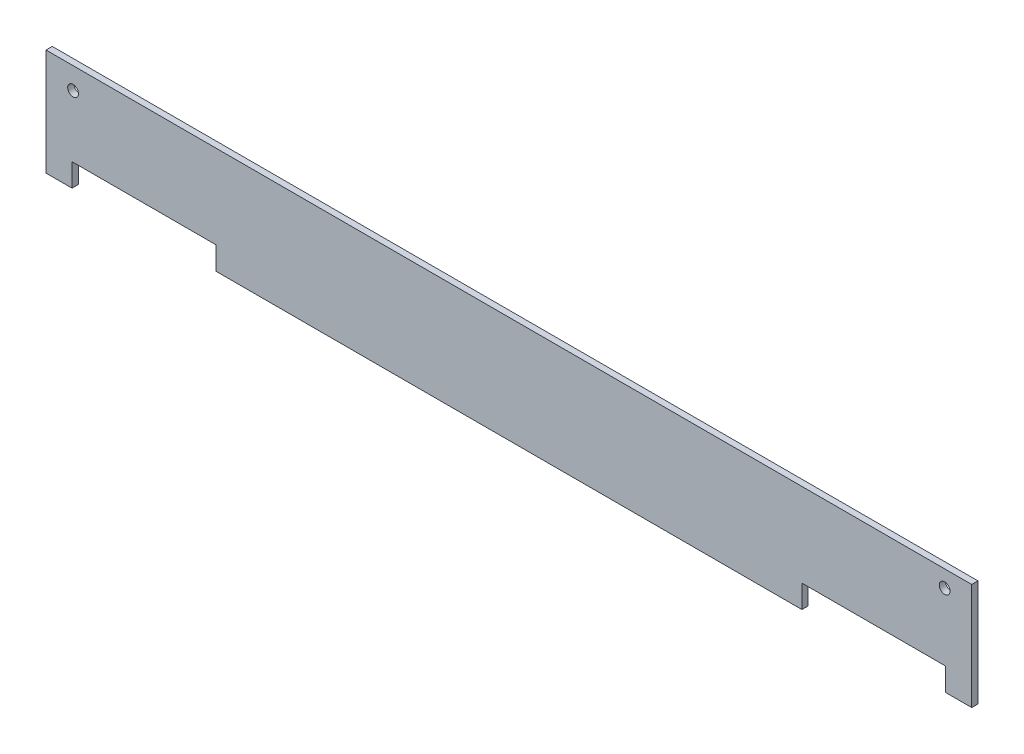
ISO-10303-21;
HEADER;
FILE_DESCRIPTION(('STEP AP214'),'2;1');
FILE_NAME('part.step','',(''),(''),'','','');
FILE_SCHEMA(('AUTOMOTIVE_DESIGN { 1 0 10303 214 1 1 1 1 }'));
ENDSEC;
DATA;
#1=APPLICATION_CONTEXT('core data for automotive mechanical design processes');
#2=APPLICATION_PROTOCOL_DEFINITION('international standard','automotive_design',2000,#1);
#3=PRODUCT_CONTEXT('',#1,'mechanical');
#4=PRODUCT('Part','Part','',(#3));
#5=PRODUCT_RELATED_PRODUCT_CATEGORY('part','',(#4));
#6=PRODUCT_DEFINITION_FORMATION('','',#4);
#7=PRODUCT_DEFINITION_CONTEXT('part definition',#1,'design');
#8=PRODUCT_DEFINITION('design','',#6,#7);
#9=PRODUCT_DEFINITION_SHAPE('','',#8);
#10=(LENGTH_UNIT() NAMED_UNIT(*) SI_UNIT(.MILLI.,.METRE.));
#11=(NAMED_UNIT(*) PLANE_ANGLE_UNIT() SI_UNIT($,.RADIAN.));
#12=(NAMED_UNIT(*) SI_UNIT($,.STERADIAN.) SOLID_ANGLE_UNIT());
#13=UNCERTAINTY_MEASURE_WITH_UNIT(LENGTH_MEASURE(1.E-05),#10,'distance_accuracy_value','');
#14=(GEOMETRIC_REPRESENTATION_CONTEXT(3) GLOBAL_UNCERTAINTY_ASSIGNED_CONTEXT((#13)) GLOBAL_UNIT_ASSIGNED_CONTEXT((#10,
#11,#12)) REPRESENTATION_CONTEXT('',''));
#15=CARTESIAN_POINT('',(0.,0.,0.));
#16=DIRECTION('',(0.,0.,1.));
#17=DIRECTION('',(1.,0.,0.));
#18=AXIS2_PLACEMENT_3D('',#15,#16,#17);
#19=CARTESIAN_POINT('',(0.,0.,3.));
#20=DIRECTION('',(0.,1.,0.));
#21=DIRECTION('',(-1.,0.,0.));
#22=AXIS2_PLACEMENT_3D('',#19,#20,#21);
#23=PLANE('',#22);
#24=DIRECTION('',(1.,0.,0.));
#25=VECTOR('',#24,1.);
#26=CARTESIAN_POINT('',(0.,0.,0.));
#27=LINE('',#26,#25);
#28=CARTESIAN_POINT('',(-444.3,0.,0.));
#29=VERTEX_POINT('',#28);
#30=CARTESIAN_POINT('',(-431.8,0.,0.));
#31=VERTEX_POINT('',#30);
#32=EDGE_CURVE('E201',#29,#31,#27,.T.);
#33=ORIENTED_EDGE('',*,*,#32,.T.);
#34=DIRECTION('',(0.,0.,-1.));
#35=VECTOR('',#34,1.);
#36=CARTESIAN_POINT('',(-431.8,0.,3.));
#37=LINE('',#36,#35);
#38=CARTESIAN_POINT('',(-431.8,0.,3.));
#39=VERTEX_POINT('',#38);
#40=EDGE_CURVE('E183',#39,#31,#37,.T.);
#41=ORIENTED_EDGE('',*,*,#40,.F.);
#42=DIRECTION('',(1.,0.,0.));
#43=VECTOR('',#42,1.);
#44=CARTESIAN_POINT('',(0.,0.,3.));
#45=LINE('',#44,#43);
#46=CARTESIAN_POINT('',(-444.3,0.,3.));
#47=VERTEX_POINT('',#46);
#48=EDGE_CURVE('E206',#47,#39,#45,.T.);
#49=ORIENTED_EDGE('',*,*,#48,.F.);
#50=DIRECTION('',(0.,0.,-1.));
#51=VECTOR('',#50,1.);
#52=CARTESIAN_POINT('',(-444.3,0.,3.));
#53=LINE('',#52,#51);
#54=EDGE_CURVE('E223',#47,#29,#53,.T.);
#55=ORIENTED_EDGE('',*,*,#54,.T.);
#56=EDGE_LOOP('',(#33,#41,#49,#55));
#57=FACE_BOUND('',#56,.T.);
#58=ADVANCED_FACE('F47',(#57),#23,.F.);
#59=CARTESIAN_POINT('',(-12.5,0.,3.));
#60=VERTEX_POINT('',#59);
#61=CARTESIAN_POINT('',(0.,0.,3.));
#62=VERTEX_POINT('',#61);
#63=EDGE_CURVE('E205',#60,#62,#45,.T.);
#64=ORIENTED_EDGE('',*,*,#63,.F.);
#65=DIRECTION('',(0.,0.,1.));
#66=VECTOR('',#65,1.);
#67=CARTESIAN_POINT('',(-12.5,0.,3.));
#68=LINE('',#67,#66);
#69=CARTESIAN_POINT('',(-12.5,0.,0.));
#70=VERTEX_POINT('',#69);
#71=EDGE_CURVE('E178',#70,#60,#68,.T.);
#72=ORIENTED_EDGE('',*,*,#71,.F.);
#73=CARTESIAN_POINT('',(0.,0.,0.));
#74=VERTEX_POINT('',#73);
#75=EDGE_CURVE('E218',#70,#74,#27,.T.);
#76=ORIENTED_EDGE('',*,*,#75,.T.);
#77=DIRECTION('',(0.,0.,-1.));
#78=VECTOR('',#77,1.);
#79=CARTESIAN_POINT('',(0.,0.,3.));
#80=LINE('',#79,#78);
#81=EDGE_CURVE('E209',#62,#74,#80,.T.);
#82=ORIENTED_EDGE('',*,*,#81,.F.);
#83=EDGE_LOOP('',(#64,#72,#76,#82));
#84=FACE_BOUND('',#83,.T.);
#85=ADVANCED_FACE('F250',(#84),#23,.F.);
#86=CARTESIAN_POINT('',(0.,0.,3.));
#87=DIRECTION('',(-1.,0.,0.));
#88=DIRECTION('',(0.,0.,1.));
#89=AXIS2_PLACEMENT_3D('',#86,#87,#88);
#90=PLANE('',#89);
#91=DIRECTION('',(0.,1.,0.));
#92=VECTOR('',#91,1.);
#93=CARTESIAN_POINT('',(0.,0.,0.));
#94=LINE('',#93,#92);
#95=CARTESIAN_POINT('',(0.,51.18,0.));
#96=VERTEX_POINT('',#95);
#97=EDGE_CURVE('E211',#74,#96,#94,.T.);
#98=ORIENTED_EDGE('',*,*,#97,.T.);
#99=DIRECTION('',(0.,0.,-1.));
#100=VECTOR('',#99,1.);
#101=CARTESIAN_POINT('',(0.,51.18,3.));
#102=LINE('',#101,#100);
#103=CARTESIAN_POINT('',(0.,51.18,3.));
#104=VERTEX_POINT('',#103);
#105=EDGE_CURVE('E13',#104,#96,#102,.T.);
#106=ORIENTED_EDGE('',*,*,#105,.F.);
#107=DIRECTION('',(0.,1.,0.));
#108=VECTOR('',#107,1.);
#109=CARTESIAN_POINT('',(0.,0.,3.));
#110=LINE('',#109,#108);
#111=EDGE_CURVE('E197',#62,#104,#110,.T.);
#112=ORIENTED_EDGE('',*,*,#111,.F.);
#113=ORIENTED_EDGE('',*,*,#81,.T.);
#114=EDGE_LOOP('',(#98,#106,#112,#113));
#115=FACE_BOUND('',#114,.T.);
#116=ADVANCED_FACE('F49',(#115),#90,.F.);
#117=CARTESIAN_POINT('',(0.,51.18,3.));
#118=DIRECTION('',(0.,-1.,0.));
#119=DIRECTION('',(1.,0.,0.));
#120=AXIS2_PLACEMENT_3D('',#117,#118,#119);
#121=PLANE('',#120);
#122=DIRECTION('',(-1.,0.,0.));
#123=VECTOR('',#122,1.);
#124=CARTESIAN_POINT('',(0.,51.18,0.));
#125=LINE('',#124,#123);
#126=CARTESIAN_POINT('',(-444.3,51.18,0.));
#127=VERTEX_POINT('',#126);
#128=EDGE_CURVE('E214',#96,#127,#125,.T.);
#129=ORIENTED_EDGE('',*,*,#128,.T.);
#130=DIRECTION('',(0.,0.,-1.));
#131=VECTOR('',#130,1.);
#132=CARTESIAN_POINT('',(-444.3,51.18,3.));
#133=LINE('',#132,#131);
#134=CARTESIAN_POINT('',(-444.3,51.18,3.));
#135=VERTEX_POINT('',#134);
#136=EDGE_CURVE('E56',#135,#127,#133,.T.);
#137=ORIENTED_EDGE('',*,*,#136,.F.);
#138=DIRECTION('',(-1.,0.,0.));
#139=VECTOR('',#138,1.);
#140=CARTESIAN_POINT('',(0.,51.18,3.));
#141=LINE('',#140,#139);
#142=EDGE_CURVE('E200',#104,#135,#141,.T.);
#143=ORIENTED_EDGE('',*,*,#142,.F.);
#144=ORIENTED_EDGE('',*,*,#105,.T.);
#145=EDGE_LOOP('',(#129,#137,#143,#144));
#146=FACE_BOUND('',#145,.T.);
#147=ADVANCED_FACE('F270',(#146),#121,.F.);
#148=CARTESIAN_POINT('',(-444.3,0.,3.));
#149=DIRECTION('',(1.,0.,0.));
#150=DIRECTION('',(0.,0.,-1.));
#151=AXIS2_PLACEMENT_3D('',#148,#149,#150);
#152=PLANE('',#151);
#153=DIRECTION('',(0.,-1.,0.));
#154=VECTOR('',#153,1.);
#155=CARTESIAN_POINT('',(-444.3,0.,0.));
#156=LINE('',#155,#154);
#157=EDGE_CURVE('E216',#127,#29,#156,.T.);
#158=ORIENTED_EDGE('',*,*,#157,.T.);
#159=ORIENTED_EDGE('',*,*,#54,.F.);
#160=DIRECTION('',(0.,-1.,0.));
#161=VECTOR('',#160,1.);
#162=CARTESIAN_POINT('',(-444.3,0.,3.));
#163=LINE('',#162,#161);
#164=EDGE_CURVE('E203',#135,#47,#163,.T.);
#165=ORIENTED_EDGE('',*,*,#164,.F.);
#166=ORIENTED_EDGE('',*,*,#136,.T.);
#167=EDGE_LOOP('',(#158,#159,#165,#166));
#168=FACE_BOUND('',#167,.T.);
#169=ADVANCED_FACE('F262',(#168),#152,.F.);
#170=CARTESIAN_POINT('',(-362.8,0.,3.));
#171=VERTEX_POINT('',#170);
#172=CARTESIAN_POINT('',(-81.5,0.,2.99999999999999));
#173=VERTEX_POINT('',#172);
#174=EDGE_CURVE('E210',#171,#173,#45,.T.);
#175=ORIENTED_EDGE('',*,*,#174,.F.);
#176=DIRECTION('',(0.,0.,1.));
#177=VECTOR('',#176,1.);
#178=CARTESIAN_POINT('',(-362.8,0.,3.));
#179=LINE('',#178,#177);
#180=CARTESIAN_POINT('',(-362.8,0.,0.));
#181=VERTEX_POINT('',#180);
#182=EDGE_CURVE('E275',#181,#171,#179,.T.);
#183=ORIENTED_EDGE('',*,*,#182,.F.);
#184=CARTESIAN_POINT('',(-81.5,0.,0.));
#185=VERTEX_POINT('',#184);
#186=EDGE_CURVE('E160',#181,#185,#27,.T.);
#187=ORIENTED_EDGE('',*,*,#186,.T.);
#188=DIRECTION('',(0.,0.,-1.));
#189=VECTOR('',#188,1.);
#190=CARTESIAN_POINT('',(-81.5,0.,2.99999999999999));
#191=LINE('',#190,#189);
#192=EDGE_CURVE('E172',#173,#185,#191,.T.);
#193=ORIENTED_EDGE('',*,*,#192,.F.);
#194=EDGE_LOOP('',(#175,#183,#187,#193));
#195=FACE_BOUND('',#194,.T.);
#196=ADVANCED_FACE('F253',(#195),#23,.F.);
#197=CARTESIAN_POINT('',(0.,0.,3.));
#198=DIRECTION('',(0.,0.,1.));
#199=DIRECTION('',(1.,0.,0.));
#200=AXIS2_PLACEMENT_3D('',#197,#198,#199);
#201=PLANE('',#200);
#202=DIRECTION('',(0.,-1.,0.));
#203=VECTOR('',#202,1.);
#204=CARTESIAN_POINT('',(-431.8,11.,3.));
#205=LINE('',#204,#203);
#206=CARTESIAN_POINT('',(-431.8,11.,3.));
#207=VERTEX_POINT('',#206);
#208=EDGE_CURVE('E163',#207,#39,#205,.T.);
#209=ORIENTED_EDGE('',*,*,#208,.F.);
#210=DIRECTION('',(-1.,0.,0.));
#211=VECTOR('',#210,1.);
#212=CARTESIAN_POINT('',(-431.8,11.,3.));
#213=LINE('',#212,#211);
#214=CARTESIAN_POINT('',(-362.8,11.,3.));
#215=VERTEX_POINT('',#214);
#216=EDGE_CURVE('E147',#215,#207,#213,.T.);
#217=ORIENTED_EDGE('',*,*,#216,.F.);
#218=DIRECTION('',(0.,-1.,0.));
#219=VECTOR('',#218,1.);
#220=CARTESIAN_POINT('',(-362.8,11.,3.));
#221=LINE('',#220,#219);
#222=EDGE_CURVE('E145',#215,#171,#221,.T.);
#223=ORIENTED_EDGE('',*,*,#222,.T.);
#224=ORIENTED_EDGE('',*,*,#174,.T.);
#225=DIRECTION('',(0.,-1.,0.));
#226=VECTOR('',#225,1.);
#227=CARTESIAN_POINT('',(-81.5,11.,2.99999999999999));
#228=LINE('',#227,#226);
#229=CARTESIAN_POINT('',(-81.5,11.,2.99999999999999));
#230=VERTEX_POINT('',#229);
#231=EDGE_CURVE('E186',#230,#173,#228,.T.);
#232=ORIENTED_EDGE('',*,*,#231,.F.);
#233=DIRECTION('',(-1.,0.,0.));
#234=VECTOR('',#233,1.);
#235=CARTESIAN_POINT('',(-12.5,11.,3.));
#236=LINE('',#235,#234);
#237=CARTESIAN_POINT('',(-12.5,11.,3.));
#238=VERTEX_POINT('',#237);
#239=EDGE_CURVE('E171',#238,#230,#236,.T.);
#240=ORIENTED_EDGE('',*,*,#239,.F.);
#241=DIRECTION('',(0.,-1.,0.));
#242=VECTOR('',#241,1.);
#243=CARTESIAN_POINT('',(-12.5,11.,3.));
#244=LINE('',#243,#242);
#245=EDGE_CURVE('E177',#238,#60,#244,.T.);
#246=ORIENTED_EDGE('',*,*,#245,.T.);
#247=ORIENTED_EDGE('',*,*,#63,.T.);
#248=ORIENTED_EDGE('',*,*,#111,.T.);
#249=ORIENTED_EDGE('',*,*,#142,.T.);
#250=ORIENTED_EDGE('',*,*,#164,.T.);
#251=ORIENTED_EDGE('',*,*,#48,.T.);
#252=EDGE_LOOP('',(#209,#217,#223,#224,#232,#240,#246,#247,#248,#249,#250,#251));
#253=FACE_BOUND('',#252,.T.);
#254=CARTESIAN_POINT('',(-13.,43.1658068315665,3.));
#255=DIRECTION('',(0.,0.,1.));
#256=DIRECTION('',(1.,0.,0.));
#257=AXIS2_PLACEMENT_3D('',#254,#255,#256);
#258=CIRCLE('',#257,2.6);
#259=CARTESIAN_POINT('',(-10.4,43.1658068315665,3.));
#260=VERTEX_POINT('',#259);
#261=EDGE_CURVE('E190',#260,#260,#258,.T.);
#262=ORIENTED_EDGE('',*,*,#261,.F.);
#263=EDGE_LOOP('',(#262));
#264=FACE_BOUND('',#263,.T.);
#265=CARTESIAN_POINT('',(-431.3,40.774785784215,3.));
#266=DIRECTION('',(0.,0.,1.));
#267=DIRECTION('',(1.,0.,0.));
#268=AXIS2_PLACEMENT_3D('',#265,#266,#267);
#269=CIRCLE('',#268,2.60000000000007);
#270=CARTESIAN_POINT('',(-428.7,40.774785784215,3.));
#271=VERTEX_POINT('',#270);
#272=EDGE_CURVE('E194',#271,#271,#269,.T.);
#273=ORIENTED_EDGE('',*,*,#272,.F.);
#274=EDGE_LOOP('',(#273));
#275=FACE_BOUND('',#274,.T.);
#276=ADVANCED_FACE('F261',(#253,#264,#275),#201,.T.);
#277=CARTESIAN_POINT('',(0.,0.,0.));
#278=DIRECTION('',(0.,0.,1.));
#279=DIRECTION('',(1.,0.,0.));
#280=AXIS2_PLACEMENT_3D('',#277,#278,#279);
#281=PLANE('',#280);
#282=DIRECTION('',(1.,0.,0.));
#283=VECTOR('',#282,1.);
#284=CARTESIAN_POINT('',(-431.8,11.,0.));
#285=LINE('',#284,#283);
#286=CARTESIAN_POINT('',(-431.8,11.,0.));
#287=VERTEX_POINT('',#286);
#288=CARTESIAN_POINT('',(-362.8,11.,0.));
#289=VERTEX_POINT('',#288);
#290=EDGE_CURVE('E148',#287,#289,#285,.T.);
#291=ORIENTED_EDGE('',*,*,#290,.F.);
#292=DIRECTION('',(0.,-1.,0.));
#293=VECTOR('',#292,1.);
#294=CARTESIAN_POINT('',(-431.8,11.,0.));
#295=LINE('',#294,#293);
#296=EDGE_CURVE('E161',#287,#31,#295,.T.);
#297=ORIENTED_EDGE('',*,*,#296,.T.);
#298=ORIENTED_EDGE('',*,*,#32,.F.);
#299=ORIENTED_EDGE('',*,*,#157,.F.);
#300=ORIENTED_EDGE('',*,*,#128,.F.);
#301=ORIENTED_EDGE('',*,*,#97,.F.);
#302=ORIENTED_EDGE('',*,*,#75,.F.);
#303=DIRECTION('',(0.,-1.,0.));
#304=VECTOR('',#303,1.);
#305=CARTESIAN_POINT('',(-12.5,11.,0.));
#306=LINE('',#305,#304);
#307=CARTESIAN_POINT('',(-12.5,11.,0.));
#308=VERTEX_POINT('',#307);
#309=EDGE_CURVE('E181',#308,#70,#306,.T.);
#310=ORIENTED_EDGE('',*,*,#309,.F.);
#311=DIRECTION('',(1.,0.,0.));
#312=VECTOR('',#311,1.);
#313=CARTESIAN_POINT('',(-12.5,11.,0.));
#314=LINE('',#313,#312);
#315=CARTESIAN_POINT('',(-81.5,11.,0.));
#316=VERTEX_POINT('',#315);
#317=EDGE_CURVE('E175',#316,#308,#314,.T.);
#318=ORIENTED_EDGE('',*,*,#317,.F.);
#319=DIRECTION('',(0.,-1.,0.));
#320=VECTOR('',#319,1.);
#321=CARTESIAN_POINT('',(-81.5,11.,0.));
#322=LINE('',#321,#320);
#323=EDGE_CURVE('E184',#316,#185,#322,.T.);
#324=ORIENTED_EDGE('',*,*,#323,.T.);
#325=ORIENTED_EDGE('',*,*,#186,.F.);
#326=DIRECTION('',(0.,-1.,0.));
#327=VECTOR('',#326,1.);
#328=CARTESIAN_POINT('',(-362.8,11.,0.));
#329=LINE('',#328,#327);
#330=EDGE_CURVE('E142',#289,#181,#329,.T.);
#331=ORIENTED_EDGE('',*,*,#330,.F.);
#332=EDGE_LOOP('',(#291,#297,#298,#299,#300,#301,#302,#310,#318,#324,#325,#331));
#333=FACE_BOUND('',#332,.T.);
#334=CARTESIAN_POINT('',(-13.,43.1658068315665,0.));
#335=DIRECTION('',(0.,0.,1.));
#336=DIRECTION('',(1.,0.,0.));
#337=AXIS2_PLACEMENT_3D('',#334,#335,#336);
#338=CIRCLE('',#337,2.6);
#339=CARTESIAN_POINT('',(-10.4,43.1658068315665,0.));
#340=VERTEX_POINT('',#339);
#341=EDGE_CURVE('E51',#340,#340,#338,.T.);
#342=ORIENTED_EDGE('',*,*,#341,.T.);
#343=EDGE_LOOP('',(#342));
#344=FACE_BOUND('',#343,.T.);
#345=CARTESIAN_POINT('',(-431.3,40.774785784215,0.));
#346=DIRECTION('',(0.,0.,1.));
#347=DIRECTION('',(1.,0.,0.));
#348=AXIS2_PLACEMENT_3D('',#345,#346,#347);
#349=CIRCLE('',#348,2.60000000000007);
#350=CARTESIAN_POINT('',(-428.7,40.774785784215,0.));
#351=VERTEX_POINT('',#350);
#352=EDGE_CURVE('E193',#351,#351,#349,.T.);
#353=ORIENTED_EDGE('',*,*,#352,.T.);
#354=EDGE_LOOP('',(#353));
#355=FACE_BOUND('',#354,.T.);
#356=ADVANCED_FACE('F156',(#333,#344,#355),#281,.F.);
#357=CARTESIAN_POINT('',(-431.3,40.774785784215,-17.));
#358=DIRECTION('',(0.,0.,1.));
#359=DIRECTION('',(1.,0.,0.));
#360=AXIS2_PLACEMENT_3D('',#357,#358,#359);
#361=CYLINDRICAL_SURFACE('',#360,2.60000000000007);
#362=ORIENTED_EDGE('',*,*,#272,.T.);
#363=EDGE_LOOP('',(#362));
#364=FACE_BOUND('',#363,.T.);
#365=ORIENTED_EDGE('',*,*,#352,.F.);
#366=EDGE_LOOP('',(#365));
#367=FACE_BOUND('',#366,.T.);
#368=ADVANCED_FACE('F236',(#364,#367),#361,.F.);
#369=CARTESIAN_POINT('',(-13.,43.1658068315665,-17.));
#370=DIRECTION('',(0.,0.,1.));
#371=DIRECTION('',(1.,0.,0.));
#372=AXIS2_PLACEMENT_3D('',#369,#370,#371);
#373=CYLINDRICAL_SURFACE('',#372,2.6);
#374=ORIENTED_EDGE('',*,*,#261,.T.);
#375=EDGE_LOOP('',(#374));
#376=FACE_BOUND('',#375,.T.);
#377=ORIENTED_EDGE('',*,*,#341,.F.);
#378=EDGE_LOOP('',(#377));
#379=FACE_BOUND('',#378,.T.);
#380=ADVANCED_FACE('F233',(#376,#379),#373,.F.);
#381=CARTESIAN_POINT('',(-12.5,11.,3.));
#382=DIRECTION('',(1.,0.,0.));
#383=DIRECTION('',(0.,0.,-1.));
#384=AXIS2_PLACEMENT_3D('',#381,#382,#383);
#385=PLANE('',#384);
#386=ORIENTED_EDGE('',*,*,#71,.T.);
#387=ORIENTED_EDGE('',*,*,#245,.F.);
#388=DIRECTION('',(0.,0.,1.));
#389=VECTOR('',#388,1.);
#390=CARTESIAN_POINT('',(-12.5,11.,3.));
#391=LINE('',#390,#389);
#392=EDGE_CURVE('E168',#308,#238,#391,.T.);
#393=ORIENTED_EDGE('',*,*,#392,.F.);
#394=ORIENTED_EDGE('',*,*,#309,.T.);
#395=EDGE_LOOP('',(#386,#387,#393,#394));
#396=FACE_BOUND('',#395,.T.);
#397=ADVANCED_FACE('F235',(#396),#385,.F.);
#398=CARTESIAN_POINT('',(-81.5,11.,2.99999999999999));
#399=DIRECTION('',(-1.,0.,0.));
#400=DIRECTION('',(0.,-1.,0.));
#401=AXIS2_PLACEMENT_3D('',#398,#399,#400);
#402=PLANE('',#401);
#403=ORIENTED_EDGE('',*,*,#192,.T.);
#404=ORIENTED_EDGE('',*,*,#323,.F.);
#405=DIRECTION('',(0.,0.,-1.));
#406=VECTOR('',#405,1.);
#407=CARTESIAN_POINT('',(-81.5,11.,2.99999999999999));
#408=LINE('',#407,#406);
#409=EDGE_CURVE('E72',#230,#316,#408,.T.);
#410=ORIENTED_EDGE('',*,*,#409,.F.);
#411=ORIENTED_EDGE('',*,*,#231,.T.);
#412=EDGE_LOOP('',(#403,#404,#410,#411));
#413=FACE_BOUND('',#412,.T.);
#414=ADVANCED_FACE('F244',(#413),#402,.F.);
#415=CARTESIAN_POINT('',(0.,11.,0.));
#416=DIRECTION('',(0.,1.,0.));
#417=DIRECTION('',(-1.,0.,0.));
#418=AXIS2_PLACEMENT_3D('',#415,#416,#417);
#419=PLANE('',#418);
#420=ORIENTED_EDGE('',*,*,#392,.T.);
#421=ORIENTED_EDGE('',*,*,#239,.T.);
#422=ORIENTED_EDGE('',*,*,#409,.T.);
#423=ORIENTED_EDGE('',*,*,#317,.T.);
#424=EDGE_LOOP('',(#420,#421,#422,#423));
#425=FACE_BOUND('',#424,.T.);
#426=ADVANCED_FACE('F304',(#425),#419,.F.);
#427=CARTESIAN_POINT('',(-431.8,11.,3.));
#428=DIRECTION('',(-1.,0.,0.));
#429=DIRECTION('',(0.,-1.,0.));
#430=AXIS2_PLACEMENT_3D('',#427,#428,#429);
#431=PLANE('',#430);
#432=ORIENTED_EDGE('',*,*,#40,.T.);
#433=ORIENTED_EDGE('',*,*,#296,.F.);
#434=DIRECTION('',(0.,0.,-1.));
#435=VECTOR('',#434,1.);
#436=CARTESIAN_POINT('',(-431.8,11.,3.));
#437=LINE('',#436,#435);
#438=EDGE_CURVE('E64',#207,#287,#437,.T.);
#439=ORIENTED_EDGE('',*,*,#438,.F.);
#440=ORIENTED_EDGE('',*,*,#208,.T.);
#441=EDGE_LOOP('',(#432,#433,#439,#440));
#442=FACE_BOUND('',#441,.T.);
#443=ADVANCED_FACE('F300',(#442),#431,.F.);
#444=CARTESIAN_POINT('',(-362.8,11.,3.));
#445=DIRECTION('',(1.,0.,0.));
#446=DIRECTION('',(0.,1.,0.));
#447=AXIS2_PLACEMENT_3D('',#444,#445,#446);
#448=PLANE('',#447);
#449=ORIENTED_EDGE('',*,*,#182,.T.);
#450=ORIENTED_EDGE('',*,*,#222,.F.);
#451=DIRECTION('',(0.,0.,1.));
#452=VECTOR('',#451,1.);
#453=CARTESIAN_POINT('',(-362.8,11.,3.));
#454=LINE('',#453,#452);
#455=EDGE_CURVE('E139',#289,#215,#454,.T.);
#456=ORIENTED_EDGE('',*,*,#455,.F.);
#457=ORIENTED_EDGE('',*,*,#330,.T.);
#458=EDGE_LOOP('',(#449,#450,#456,#457));
#459=FACE_BOUND('',#458,.T.);
#460=ADVANCED_FACE('F140',(#459),#448,.F.);
#461=CARTESIAN_POINT('',(0.,11.,0.));
#462=DIRECTION('',(0.,-1.,0.));
#463=DIRECTION('',(1.,0.,0.));
#464=AXIS2_PLACEMENT_3D('',#461,#462,#463);
#465=PLANE('',#464);
#466=ORIENTED_EDGE('',*,*,#438,.T.);
#467=ORIENTED_EDGE('',*,*,#290,.T.);
#468=ORIENTED_EDGE('',*,*,#455,.T.);
#469=ORIENTED_EDGE('',*,*,#216,.T.);
#470=EDGE_LOOP('',(#466,#467,#468,#469));
#471=FACE_BOUND('',#470,.T.);
#472=ADVANCED_FACE('F151',(#471),#465,.T.);
#473=CLOSED_SHELL('',(#58,#85,#116,#147,#169,#196,#276,#356,#368,#380,#397,#414,#426,#443,#460,#472));
#474=MANIFOLD_SOLID_BREP('B2',#473);
#475=ADVANCED_BREP_SHAPE_REPRESENTATION('',(#18,#474),#14);
#476=SHAPE_DEFINITION_REPRESENTATION(#9,#475);
ENDSEC;
END-ISO-10303-21;
